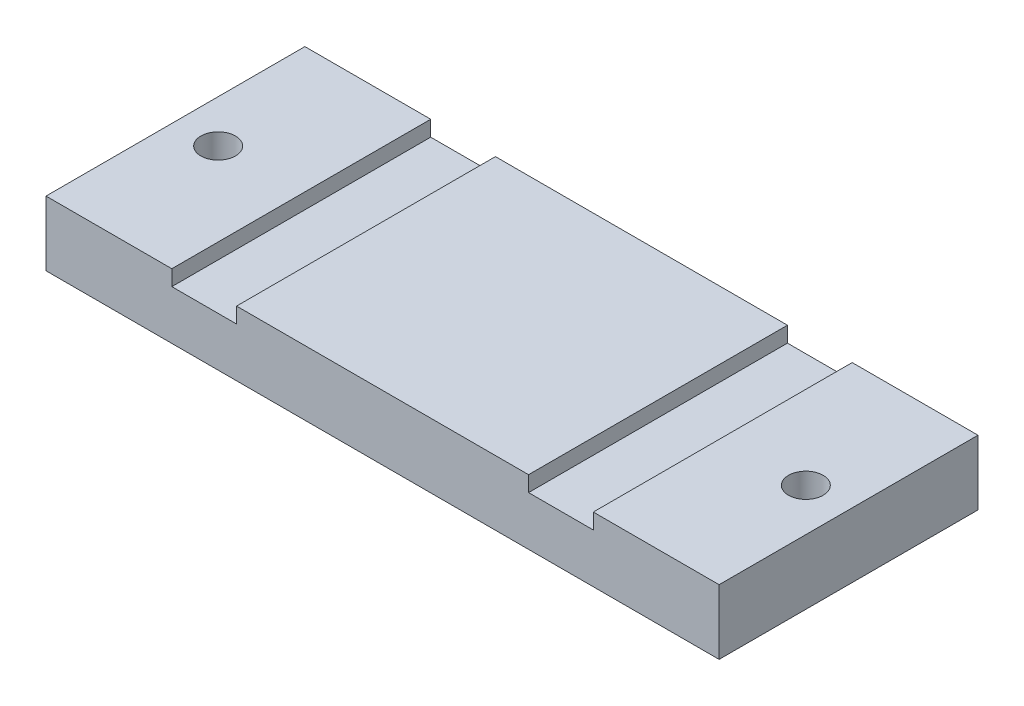
ISO-10303-21;
HEADER;
FILE_DESCRIPTION(('STEP AP214'),'2;1');
FILE_NAME('part.step','',(''),(''),'','','');
FILE_SCHEMA(('AUTOMOTIVE_DESIGN { 1 0 10303 214 1 1 1 1 }'));
ENDSEC;
DATA;
#1=APPLICATION_CONTEXT('core data for automotive mechanical design processes');
#2=APPLICATION_PROTOCOL_DEFINITION('international standard','automotive_design',2000,#1);
#3=PRODUCT_CONTEXT('',#1,'mechanical');
#4=PRODUCT('Part','Part','',(#3));
#5=PRODUCT_RELATED_PRODUCT_CATEGORY('part','',(#4));
#6=PRODUCT_DEFINITION_FORMATION('','',#4);
#7=PRODUCT_DEFINITION_CONTEXT('part definition',#1,'design');
#8=PRODUCT_DEFINITION('design','',#6,#7);
#9=PRODUCT_DEFINITION_SHAPE('','',#8);
#10=(LENGTH_UNIT() NAMED_UNIT(*) SI_UNIT(.MILLI.,.METRE.));
#11=(NAMED_UNIT(*) PLANE_ANGLE_UNIT() SI_UNIT($,.RADIAN.));
#12=(NAMED_UNIT(*) SI_UNIT($,.STERADIAN.) SOLID_ANGLE_UNIT());
#13=UNCERTAINTY_MEASURE_WITH_UNIT(LENGTH_MEASURE(1.E-05),#10,'distance_accuracy_value','');
#14=(GEOMETRIC_REPRESENTATION_CONTEXT(3) GLOBAL_UNCERTAINTY_ASSIGNED_CONTEXT((#13)) GLOBAL_UNIT_ASSIGNED_CONTEXT((#10,
#11,#12)) REPRESENTATION_CONTEXT('',''));
#15=CARTESIAN_POINT('',(0.,0.,0.));
#16=DIRECTION('',(0.,0.,1.));
#17=DIRECTION('',(1.,0.,0.));
#18=AXIS2_PLACEMENT_3D('',#15,#16,#17);
#19=CARTESIAN_POINT('',(0.,6.35,0.));
#20=DIRECTION('',(0.,-1.,0.));
#21=DIRECTION('',(0.,0.,-1.));
#22=AXIS2_PLACEMENT_3D('',#19,#20,#21);
#23=PLANE('',#22);
#24=CARTESIAN_POINT('',(4.191,6.35,-12.7));
#25=DIRECTION('',(0.,1.,0.));
#26=DIRECTION('',(0.,0.,1.));
#27=AXIS2_PLACEMENT_3D('',#24,#25,#26);
#28=CIRCLE('',#27,1.7);
#29=CARTESIAN_POINT('',(4.191,6.35,-11.));
#30=VERTEX_POINT('',#29);
#31=EDGE_CURVE('E156',#30,#30,#28,.T.);
#32=ORIENTED_EDGE('',*,*,#31,.F.);
#33=EDGE_LOOP('',(#32));
#34=FACE_BOUND('',#33,.T.);
#35=DIRECTION('',(1.,0.,0.));
#36=VECTOR('',#35,1.);
#37=CARTESIAN_POINT('',(0.,6.35,0.));
#38=LINE('',#37,#36);
#39=CARTESIAN_POINT('',(0.,6.35,0.));
#40=VERTEX_POINT('',#39);
#41=CARTESIAN_POINT('',(12.345,6.35,0.));
#42=VERTEX_POINT('',#41);
#43=EDGE_CURVE('E200',#40,#42,#38,.T.);
#44=ORIENTED_EDGE('',*,*,#43,.T.);
#45=DIRECTION('',(0.,0.,1.));
#46=VECTOR('',#45,1.);
#47=CARTESIAN_POINT('',(12.345,6.35,-25.4));
#48=LINE('',#47,#46);
#49=CARTESIAN_POINT('',(12.345,6.35,-25.4));
#50=VERTEX_POINT('',#49);
#51=EDGE_CURVE('E154',#50,#42,#48,.T.);
#52=ORIENTED_EDGE('',*,*,#51,.F.);
#53=DIRECTION('',(-1.,0.,0.));
#54=VECTOR('',#53,1.);
#55=CARTESIAN_POINT('',(0.,6.35,-25.4));
#56=LINE('',#55,#54);
#57=CARTESIAN_POINT('',(0.,6.35,-25.4));
#58=VERTEX_POINT('',#57);
#59=EDGE_CURVE('E145',#50,#58,#56,.T.);
#60=ORIENTED_EDGE('',*,*,#59,.T.);
#61=DIRECTION('',(0.,0.,1.));
#62=VECTOR('',#61,1.);
#63=CARTESIAN_POINT('',(0.,6.35,0.));
#64=LINE('',#63,#62);
#65=EDGE_CURVE('E195',#58,#40,#64,.T.);
#66=ORIENTED_EDGE('',*,*,#65,.T.);
#67=EDGE_LOOP('',(#44,#52,#60,#66));
#68=FACE_BOUND('',#67,.T.);
#69=ADVANCED_FACE('F33',(#34,#68),#23,.F.);
#70=CARTESIAN_POINT('',(61.849,6.35,-12.7));
#71=DIRECTION('',(0.,1.,0.));
#72=DIRECTION('',(0.,0.,1.));
#73=AXIS2_PLACEMENT_3D('',#70,#71,#72);
#74=CIRCLE('',#73,1.69999999999999);
#75=CARTESIAN_POINT('',(61.849,6.35,-11.));
#76=VERTEX_POINT('',#75);
#77=EDGE_CURVE('E188',#76,#76,#74,.T.);
#78=ORIENTED_EDGE('',*,*,#77,.F.);
#79=EDGE_LOOP('',(#78));
#80=FACE_BOUND('',#79,.T.);
#81=CARTESIAN_POINT('',(66.04,6.35,-25.4));
#82=VERTEX_POINT('',#81);
#83=CARTESIAN_POINT('',(53.695,6.35,-25.4));
#84=VERTEX_POINT('',#83);
#85=EDGE_CURVE('E206',#82,#84,#56,.T.);
#86=ORIENTED_EDGE('',*,*,#85,.T.);
#87=DIRECTION('',(0.,0.,1.));
#88=VECTOR('',#87,1.);
#89=CARTESIAN_POINT('',(53.695,6.35,-25.4));
#90=LINE('',#89,#88);
#91=CARTESIAN_POINT('',(53.695,6.35,0.));
#92=VERTEX_POINT('',#91);
#93=EDGE_CURVE('E168',#84,#92,#90,.T.);
#94=ORIENTED_EDGE('',*,*,#93,.T.);
#95=CARTESIAN_POINT('',(66.04,6.35,0.));
#96=VERTEX_POINT('',#95);
#97=EDGE_CURVE('E198',#92,#96,#38,.T.);
#98=ORIENTED_EDGE('',*,*,#97,.T.);
#99=DIRECTION('',(0.,0.,-1.));
#100=VECTOR('',#99,1.);
#101=CARTESIAN_POINT('',(66.04,6.35,0.));
#102=LINE('',#101,#100);
#103=EDGE_CURVE('E203',#96,#82,#102,.T.);
#104=ORIENTED_EDGE('',*,*,#103,.T.);
#105=EDGE_LOOP('',(#86,#94,#98,#104));
#106=FACE_BOUND('',#105,.T.);
#107=ADVANCED_FACE('F252',(#80,#106),#23,.F.);
#108=CARTESIAN_POINT('',(0.,0.,0.));
#109=DIRECTION('',(0.,-1.,0.));
#110=DIRECTION('',(0.,0.,-1.));
#111=AXIS2_PLACEMENT_3D('',#108,#109,#110);
#112=PLANE('',#111);
#113=CARTESIAN_POINT('',(4.191,0.,-12.7));
#114=DIRECTION('',(0.,1.,0.));
#115=DIRECTION('',(0.,0.,1.));
#116=AXIS2_PLACEMENT_3D('',#113,#114,#115);
#117=CIRCLE('',#116,1.7);
#118=CARTESIAN_POINT('',(4.191,0.,-11.));
#119=VERTEX_POINT('',#118);
#120=EDGE_CURVE('E185',#119,#119,#117,.T.);
#121=ORIENTED_EDGE('',*,*,#120,.T.);
#122=EDGE_LOOP('',(#121));
#123=FACE_BOUND('',#122,.T.);
#124=DIRECTION('',(0.,0.,1.));
#125=VECTOR('',#124,1.);
#126=CARTESIAN_POINT('',(0.,0.,0.));
#127=LINE('',#126,#125);
#128=CARTESIAN_POINT('',(0.,0.,-25.4));
#129=VERTEX_POINT('',#128);
#130=CARTESIAN_POINT('',(0.,0.,0.));
#131=VERTEX_POINT('',#130);
#132=EDGE_CURVE('E194',#129,#131,#127,.T.);
#133=ORIENTED_EDGE('',*,*,#132,.F.);
#134=DIRECTION('',(-1.,0.,0.));
#135=VECTOR('',#134,1.);
#136=CARTESIAN_POINT('',(0.,0.,-25.4));
#137=LINE('',#136,#135);
#138=CARTESIAN_POINT('',(66.04,0.,-25.4));
#139=VERTEX_POINT('',#138);
#140=EDGE_CURVE('E199',#139,#129,#137,.T.);
#141=ORIENTED_EDGE('',*,*,#140,.F.);
#142=DIRECTION('',(0.,0.,-1.));
#143=VECTOR('',#142,1.);
#144=CARTESIAN_POINT('',(66.04,0.,0.));
#145=LINE('',#144,#143);
#146=CARTESIAN_POINT('',(66.04,0.,0.));
#147=VERTEX_POINT('',#146);
#148=EDGE_CURVE('E215',#147,#139,#145,.T.);
#149=ORIENTED_EDGE('',*,*,#148,.F.);
#150=DIRECTION('',(1.,0.,0.));
#151=VECTOR('',#150,1.);
#152=CARTESIAN_POINT('',(0.,0.,0.));
#153=LINE('',#152,#151);
#154=EDGE_CURVE('E213',#131,#147,#153,.T.);
#155=ORIENTED_EDGE('',*,*,#154,.F.);
#156=EDGE_LOOP('',(#133,#141,#149,#155));
#157=FACE_BOUND('',#156,.T.);
#158=CARTESIAN_POINT('',(61.849,0.,-12.7));
#159=DIRECTION('',(0.,1.,0.));
#160=DIRECTION('',(0.,0.,1.));
#161=AXIS2_PLACEMENT_3D('',#158,#159,#160);
#162=CIRCLE('',#161,1.69999999999999);
#163=CARTESIAN_POINT('',(61.849,0.,-11.));
#164=VERTEX_POINT('',#163);
#165=EDGE_CURVE('E191',#164,#164,#162,.T.);
#166=ORIENTED_EDGE('',*,*,#165,.T.);
#167=EDGE_LOOP('',(#166));
#168=FACE_BOUND('',#167,.T.);
#169=ADVANCED_FACE('F234',(#123,#157,#168),#112,.T.);
#170=CARTESIAN_POINT('',(0.,6.35,0.));
#171=DIRECTION('',(1.,0.,0.));
#172=DIRECTION('',(0.,0.,-1.));
#173=AXIS2_PLACEMENT_3D('',#170,#171,#172);
#174=PLANE('',#173);
#175=ORIENTED_EDGE('',*,*,#132,.T.);
#176=DIRECTION('',(0.,-1.,0.));
#177=VECTOR('',#176,1.);
#178=CARTESIAN_POINT('',(0.,6.35,0.));
#179=LINE('',#178,#177);
#180=EDGE_CURVE('E11',#40,#131,#179,.T.);
#181=ORIENTED_EDGE('',*,*,#180,.F.);
#182=ORIENTED_EDGE('',*,*,#65,.F.);
#183=DIRECTION('',(0.,-1.,0.));
#184=VECTOR('',#183,1.);
#185=CARTESIAN_POINT('',(0.,6.35,-25.4));
#186=LINE('',#185,#184);
#187=EDGE_CURVE('E209',#58,#129,#186,.T.);
#188=ORIENTED_EDGE('',*,*,#187,.T.);
#189=EDGE_LOOP('',(#175,#181,#182,#188));
#190=FACE_BOUND('',#189,.T.);
#191=ADVANCED_FACE('F35',(#190),#174,.F.);
#192=CARTESIAN_POINT('',(0.,6.35,0.));
#193=DIRECTION('',(0.,0.,-1.));
#194=DIRECTION('',(-1.,0.,0.));
#195=AXIS2_PLACEMENT_3D('',#192,#193,#194);
#196=PLANE('',#195);
#197=DIRECTION('',(1.,0.,0.));
#198=VECTOR('',#197,1.);
#199=CARTESIAN_POINT('',(12.345,4.826,0.));
#200=LINE('',#199,#198);
#201=CARTESIAN_POINT('',(12.345,4.826,0.));
#202=VERTEX_POINT('',#201);
#203=CARTESIAN_POINT('',(18.695,4.826,0.));
#204=VERTEX_POINT('',#203);
#205=EDGE_CURVE('E147',#202,#204,#200,.T.);
#206=ORIENTED_EDGE('',*,*,#205,.F.);
#207=DIRECTION('',(0.,-1.,0.));
#208=VECTOR('',#207,1.);
#209=CARTESIAN_POINT('',(12.345,6.35,0.));
#210=LINE('',#209,#208);
#211=EDGE_CURVE('E128',#42,#202,#210,.T.);
#212=ORIENTED_EDGE('',*,*,#211,.F.);
#213=ORIENTED_EDGE('',*,*,#43,.F.);
#214=ORIENTED_EDGE('',*,*,#180,.T.);
#215=ORIENTED_EDGE('',*,*,#154,.T.);
#216=DIRECTION('',(0.,-1.,0.));
#217=VECTOR('',#216,1.);
#218=CARTESIAN_POINT('',(66.04,6.35,0.));
#219=LINE('',#218,#217);
#220=EDGE_CURVE('E41',#96,#147,#219,.T.);
#221=ORIENTED_EDGE('',*,*,#220,.F.);
#222=ORIENTED_EDGE('',*,*,#97,.F.);
#223=DIRECTION('',(0.,1.,0.));
#224=VECTOR('',#223,1.);
#225=CARTESIAN_POINT('',(53.695,6.35,0.));
#226=LINE('',#225,#224);
#227=CARTESIAN_POINT('',(53.695,4.826,0.));
#228=VERTEX_POINT('',#227);
#229=EDGE_CURVE('E169',#228,#92,#226,.T.);
#230=ORIENTED_EDGE('',*,*,#229,.F.);
#231=DIRECTION('',(1.,0.,0.));
#232=VECTOR('',#231,1.);
#233=CARTESIAN_POINT('',(53.695,4.826,0.));
#234=LINE('',#233,#232);
#235=CARTESIAN_POINT('',(47.345,4.826,0.));
#236=VERTEX_POINT('',#235);
#237=EDGE_CURVE('E163',#236,#228,#234,.T.);
#238=ORIENTED_EDGE('',*,*,#237,.F.);
#239=DIRECTION('',(0.,-1.,0.));
#240=VECTOR('',#239,1.);
#241=CARTESIAN_POINT('',(47.345,6.35,0.));
#242=LINE('',#241,#240);
#243=CARTESIAN_POINT('',(47.345,6.35,0.));
#244=VERTEX_POINT('',#243);
#245=EDGE_CURVE('E171',#244,#236,#242,.T.);
#246=ORIENTED_EDGE('',*,*,#245,.F.);
#247=CARTESIAN_POINT('',(18.695,6.35,0.));
#248=VERTEX_POINT('',#247);
#249=EDGE_CURVE('E204',#248,#244,#38,.T.);
#250=ORIENTED_EDGE('',*,*,#249,.F.);
#251=DIRECTION('',(0.,1.,0.));
#252=VECTOR('',#251,1.);
#253=CARTESIAN_POINT('',(18.695,6.35,0.));
#254=LINE('',#253,#252);
#255=EDGE_CURVE('E56',#204,#248,#254,.T.);
#256=ORIENTED_EDGE('',*,*,#255,.F.);
#257=EDGE_LOOP('',(#206,#212,#213,#214,#215,#221,#222,#230,#238,#246,#250,#256));
#258=FACE_BOUND('',#257,.T.);
#259=ADVANCED_FACE('F248',(#258),#196,.F.);
#260=CARTESIAN_POINT('',(66.04,6.35,0.));
#261=DIRECTION('',(-1.,0.,0.));
#262=DIRECTION('',(0.,0.,1.));
#263=AXIS2_PLACEMENT_3D('',#260,#261,#262);
#264=PLANE('',#263);
#265=ORIENTED_EDGE('',*,*,#148,.T.);
#266=DIRECTION('',(0.,-1.,0.));
#267=VECTOR('',#266,1.);
#268=CARTESIAN_POINT('',(66.04,6.35,-25.4));
#269=LINE('',#268,#267);
#270=EDGE_CURVE('E220',#82,#139,#269,.T.);
#271=ORIENTED_EDGE('',*,*,#270,.F.);
#272=ORIENTED_EDGE('',*,*,#103,.F.);
#273=ORIENTED_EDGE('',*,*,#220,.T.);
#274=EDGE_LOOP('',(#265,#271,#272,#273));
#275=FACE_BOUND('',#274,.T.);
#276=ADVANCED_FACE('F227',(#275),#264,.F.);
#277=CARTESIAN_POINT('',(0.,6.35,-25.4));
#278=DIRECTION('',(0.,0.,1.));
#279=DIRECTION('',(1.,0.,0.));
#280=AXIS2_PLACEMENT_3D('',#277,#278,#279);
#281=PLANE('',#280);
#282=ORIENTED_EDGE('',*,*,#59,.F.);
#283=DIRECTION('',(0.,-1.,0.));
#284=VECTOR('',#283,1.);
#285=CARTESIAN_POINT('',(12.345,6.35,-25.4));
#286=LINE('',#285,#284);
#287=CARTESIAN_POINT('',(12.345,4.826,-25.4));
#288=VERTEX_POINT('',#287);
#289=EDGE_CURVE('E125',#50,#288,#286,.T.);
#290=ORIENTED_EDGE('',*,*,#289,.T.);
#291=DIRECTION('',(1.,0.,0.));
#292=VECTOR('',#291,1.);
#293=CARTESIAN_POINT('',(12.345,4.826,-25.4));
#294=LINE('',#293,#292);
#295=CARTESIAN_POINT('',(18.695,4.826,-25.4));
#296=VERTEX_POINT('',#295);
#297=EDGE_CURVE('E136',#288,#296,#294,.T.);
#298=ORIENTED_EDGE('',*,*,#297,.T.);
#299=DIRECTION('',(0.,1.,0.));
#300=VECTOR('',#299,1.);
#301=CARTESIAN_POINT('',(18.695,6.35,-25.4));
#302=LINE('',#301,#300);
#303=CARTESIAN_POINT('',(18.695,6.35,-25.4));
#304=VERTEX_POINT('',#303);
#305=EDGE_CURVE('E133',#296,#304,#302,.T.);
#306=ORIENTED_EDGE('',*,*,#305,.T.);
#307=CARTESIAN_POINT('',(47.345,6.35,-25.4));
#308=VERTEX_POINT('',#307);
#309=EDGE_CURVE('E210',#308,#304,#56,.T.);
#310=ORIENTED_EDGE('',*,*,#309,.F.);
#311=DIRECTION('',(0.,-1.,0.));
#312=VECTOR('',#311,1.);
#313=CARTESIAN_POINT('',(47.345,6.35,-25.4));
#314=LINE('',#313,#312);
#315=CARTESIAN_POINT('',(47.345,4.826,-25.4));
#316=VERTEX_POINT('',#315);
#317=EDGE_CURVE('E48',#308,#316,#314,.T.);
#318=ORIENTED_EDGE('',*,*,#317,.T.);
#319=DIRECTION('',(1.,0.,0.));
#320=VECTOR('',#319,1.);
#321=CARTESIAN_POINT('',(53.695,4.826,-25.4));
#322=LINE('',#321,#320);
#323=CARTESIAN_POINT('',(53.695,4.826,-25.4));
#324=VERTEX_POINT('',#323);
#325=EDGE_CURVE('E165',#316,#324,#322,.T.);
#326=ORIENTED_EDGE('',*,*,#325,.T.);
#327=DIRECTION('',(0.,1.,0.));
#328=VECTOR('',#327,1.);
#329=CARTESIAN_POINT('',(53.695,6.35,-25.4));
#330=LINE('',#329,#328);
#331=EDGE_CURVE('E160',#324,#84,#330,.T.);
#332=ORIENTED_EDGE('',*,*,#331,.T.);
#333=ORIENTED_EDGE('',*,*,#85,.F.);
#334=ORIENTED_EDGE('',*,*,#270,.T.);
#335=ORIENTED_EDGE('',*,*,#140,.T.);
#336=ORIENTED_EDGE('',*,*,#187,.F.);
#337=EDGE_LOOP('',(#282,#290,#298,#306,#310,#318,#326,#332,#333,#334,#335,#336));
#338=FACE_BOUND('',#337,.T.);
#339=ADVANCED_FACE('F143',(#338),#281,.F.);
#340=ORIENTED_EDGE('',*,*,#309,.T.);
#341=DIRECTION('',(0.,0.,1.));
#342=VECTOR('',#341,1.);
#343=CARTESIAN_POINT('',(18.695,6.35,-25.4));
#344=LINE('',#343,#342);
#345=EDGE_CURVE('E157',#304,#248,#344,.T.);
#346=ORIENTED_EDGE('',*,*,#345,.T.);
#347=ORIENTED_EDGE('',*,*,#249,.T.);
#348=DIRECTION('',(0.,0.,1.));
#349=VECTOR('',#348,1.);
#350=CARTESIAN_POINT('',(47.345,6.35,-25.4));
#351=LINE('',#350,#349);
#352=EDGE_CURVE('E179',#308,#244,#351,.T.);
#353=ORIENTED_EDGE('',*,*,#352,.F.);
#354=EDGE_LOOP('',(#340,#346,#347,#353));
#355=FACE_BOUND('',#354,.T.);
#356=ADVANCED_FACE('F244',(#355),#23,.F.);
#357=CARTESIAN_POINT('',(61.849,6.35,-12.7));
#358=DIRECTION('',(0.,1.,0.));
#359=DIRECTION('',(0.,0.,1.));
#360=AXIS2_PLACEMENT_3D('',#357,#358,#359);
#361=CYLINDRICAL_SURFACE('',#360,1.69999999999999);
#362=ORIENTED_EDGE('',*,*,#165,.F.);
#363=EDGE_LOOP('',(#362));
#364=FACE_BOUND('',#363,.T.);
#365=ORIENTED_EDGE('',*,*,#77,.T.);
#366=EDGE_LOOP('',(#365));
#367=FACE_BOUND('',#366,.T.);
#368=ADVANCED_FACE('F281',(#364,#367),#361,.F.);
#369=CARTESIAN_POINT('',(4.191,6.35,-12.7));
#370=DIRECTION('',(0.,1.,0.));
#371=DIRECTION('',(0.,0.,1.));
#372=AXIS2_PLACEMENT_3D('',#369,#370,#371);
#373=CYLINDRICAL_SURFACE('',#372,1.7);
#374=ORIENTED_EDGE('',*,*,#120,.F.);
#375=EDGE_LOOP('',(#374));
#376=FACE_BOUND('',#375,.T.);
#377=ORIENTED_EDGE('',*,*,#31,.T.);
#378=EDGE_LOOP('',(#377));
#379=FACE_BOUND('',#378,.T.);
#380=ADVANCED_FACE('F286',(#376,#379),#373,.F.);
#381=CARTESIAN_POINT('',(53.695,6.35,-25.4));
#382=DIRECTION('',(1.,0.,0.));
#383=DIRECTION('',(0.,1.,0.));
#384=AXIS2_PLACEMENT_3D('',#381,#382,#383);
#385=PLANE('',#384);
#386=ORIENTED_EDGE('',*,*,#229,.T.);
#387=ORIENTED_EDGE('',*,*,#93,.F.);
#388=ORIENTED_EDGE('',*,*,#331,.F.);
#389=DIRECTION('',(0.,0.,1.));
#390=VECTOR('',#389,1.);
#391=CARTESIAN_POINT('',(53.695,4.826,-25.4));
#392=LINE('',#391,#390);
#393=EDGE_CURVE('E152',#324,#228,#392,.T.);
#394=ORIENTED_EDGE('',*,*,#393,.T.);
#395=EDGE_LOOP('',(#386,#387,#388,#394));
#396=FACE_BOUND('',#395,.T.);
#397=ADVANCED_FACE('F255',(#396),#385,.F.);
#398=CARTESIAN_POINT('',(53.695,4.826,-25.4));
#399=DIRECTION('',(0.,-1.,0.));
#400=DIRECTION('',(1.,0.,0.));
#401=AXIS2_PLACEMENT_3D('',#398,#399,#400);
#402=PLANE('',#401);
#403=ORIENTED_EDGE('',*,*,#237,.T.);
#404=ORIENTED_EDGE('',*,*,#393,.F.);
#405=ORIENTED_EDGE('',*,*,#325,.F.);
#406=DIRECTION('',(0.,0.,1.));
#407=VECTOR('',#406,1.);
#408=CARTESIAN_POINT('',(47.345,4.826,-25.4));
#409=LINE('',#408,#407);
#410=EDGE_CURVE('E177',#316,#236,#409,.T.);
#411=ORIENTED_EDGE('',*,*,#410,.T.);
#412=EDGE_LOOP('',(#403,#404,#405,#411));
#413=FACE_BOUND('',#412,.T.);
#414=ADVANCED_FACE('F259',(#413),#402,.F.);
#415=CARTESIAN_POINT('',(47.345,6.35,-25.4));
#416=DIRECTION('',(-1.,0.,0.));
#417=DIRECTION('',(0.,-1.,0.));
#418=AXIS2_PLACEMENT_3D('',#415,#416,#417);
#419=PLANE('',#418);
#420=ORIENTED_EDGE('',*,*,#245,.T.);
#421=ORIENTED_EDGE('',*,*,#410,.F.);
#422=ORIENTED_EDGE('',*,*,#317,.F.);
#423=ORIENTED_EDGE('',*,*,#352,.T.);
#424=EDGE_LOOP('',(#420,#421,#422,#423));
#425=FACE_BOUND('',#424,.T.);
#426=ADVANCED_FACE('F260',(#425),#419,.F.);
#427=CARTESIAN_POINT('',(12.345,6.35,-25.4));
#428=DIRECTION('',(-1.,0.,0.));
#429=DIRECTION('',(0.,-1.,0.));
#430=AXIS2_PLACEMENT_3D('',#427,#428,#429);
#431=PLANE('',#430);
#432=ORIENTED_EDGE('',*,*,#211,.T.);
#433=DIRECTION('',(0.,0.,1.));
#434=VECTOR('',#433,1.);
#435=CARTESIAN_POINT('',(12.345,4.826,-25.4));
#436=LINE('',#435,#434);
#437=EDGE_CURVE('E121',#288,#202,#436,.T.);
#438=ORIENTED_EDGE('',*,*,#437,.F.);
#439=ORIENTED_EDGE('',*,*,#289,.F.);
#440=ORIENTED_EDGE('',*,*,#51,.T.);
#441=EDGE_LOOP('',(#432,#438,#439,#440));
#442=FACE_BOUND('',#441,.T.);
#443=ADVANCED_FACE('F123',(#442),#431,.F.);
#444=CARTESIAN_POINT('',(18.695,6.35,-25.4));
#445=DIRECTION('',(1.,0.,0.));
#446=DIRECTION('',(0.,1.,0.));
#447=AXIS2_PLACEMENT_3D('',#444,#445,#446);
#448=PLANE('',#447);
#449=ORIENTED_EDGE('',*,*,#255,.T.);
#450=ORIENTED_EDGE('',*,*,#345,.F.);
#451=ORIENTED_EDGE('',*,*,#305,.F.);
#452=DIRECTION('',(0.,0.,1.));
#453=VECTOR('',#452,1.);
#454=CARTESIAN_POINT('',(18.695,4.826,-25.4));
#455=LINE('',#454,#453);
#456=EDGE_CURVE('E132',#296,#204,#455,.T.);
#457=ORIENTED_EDGE('',*,*,#456,.T.);
#458=EDGE_LOOP('',(#449,#450,#451,#457));
#459=FACE_BOUND('',#458,.T.);
#460=ADVANCED_FACE('F247',(#459),#448,.F.);
#461=CARTESIAN_POINT('',(12.345,4.826,-25.4));
#462=DIRECTION('',(0.,-1.,0.));
#463=DIRECTION('',(1.,0.,0.));
#464=AXIS2_PLACEMENT_3D('',#461,#462,#463);
#465=PLANE('',#464);
#466=ORIENTED_EDGE('',*,*,#205,.T.);
#467=ORIENTED_EDGE('',*,*,#456,.F.);
#468=ORIENTED_EDGE('',*,*,#297,.F.);
#469=ORIENTED_EDGE('',*,*,#437,.T.);
#470=EDGE_LOOP('',(#466,#467,#468,#469));
#471=FACE_BOUND('',#470,.T.);
#472=ADVANCED_FACE('F137',(#471),#465,.F.);
#473=CLOSED_SHELL('',(#69,#107,#169,#191,#259,#276,#339,#356,#368,#380,#397,#414,#426,#443,#460,#472));
#474=MANIFOLD_SOLID_BREP('B2',#473);
#475=ADVANCED_BREP_SHAPE_REPRESENTATION('',(#18,#474),#14);
#476=SHAPE_DEFINITION_REPRESENTATION(#9,#475);
ENDSEC;
END-ISO-10303-21;
